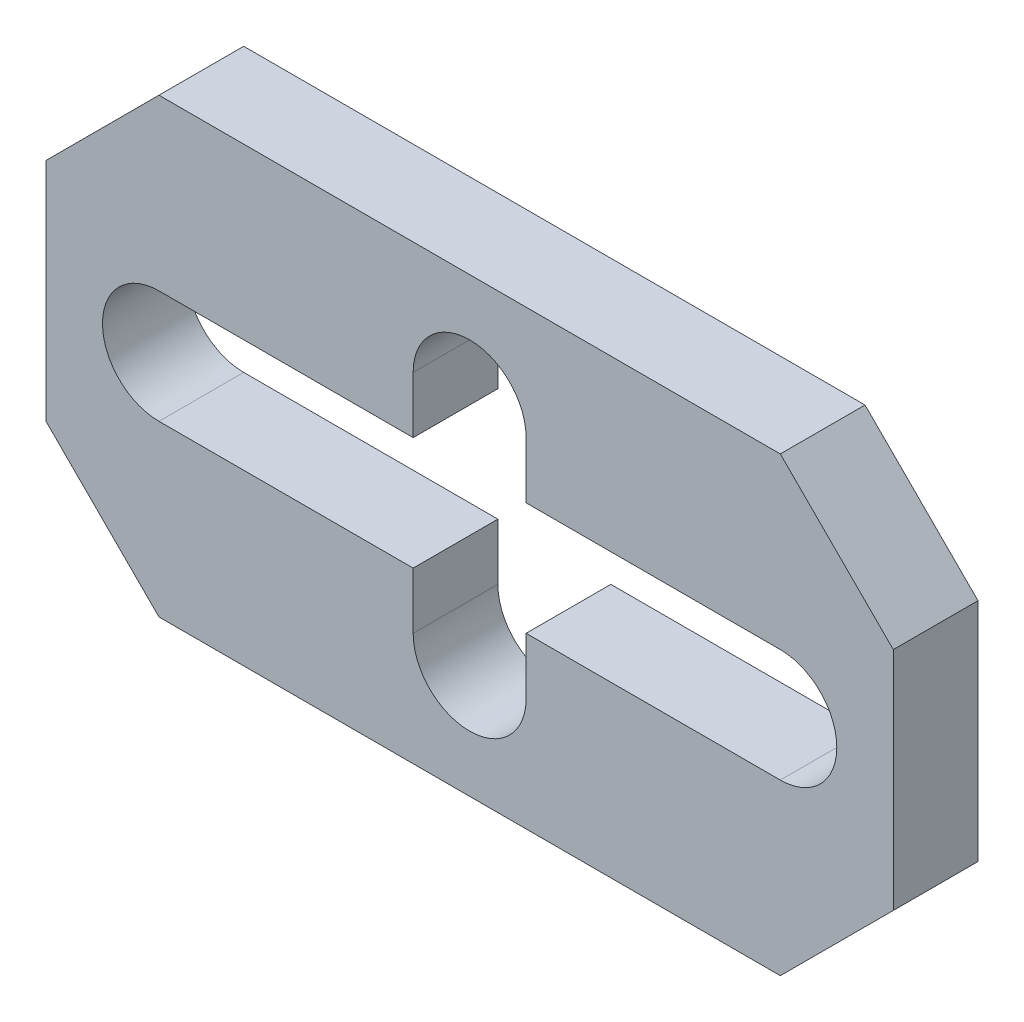
ISO-10303-21;
HEADER;
FILE_DESCRIPTION(('STEP AP214'),'2;1');
FILE_NAME('part.step','',(''),(''),'','','');
FILE_SCHEMA(('AUTOMOTIVE_DESIGN { 1 0 10303 214 1 1 1 1 }'));
ENDSEC;
DATA;
#1=APPLICATION_CONTEXT('core data for automotive mechanical design processes');
#2=APPLICATION_PROTOCOL_DEFINITION('international standard','automotive_design',2000,#1);
#3=PRODUCT_CONTEXT('',#1,'mechanical');
#4=PRODUCT('Part','Part','',(#3));
#5=PRODUCT_RELATED_PRODUCT_CATEGORY('part','',(#4));
#6=PRODUCT_DEFINITION_FORMATION('','',#4);
#7=PRODUCT_DEFINITION_CONTEXT('part definition',#1,'design');
#8=PRODUCT_DEFINITION('design','',#6,#7);
#9=PRODUCT_DEFINITION_SHAPE('','',#8);
#10=(LENGTH_UNIT() NAMED_UNIT(*) SI_UNIT(.MILLI.,.METRE.));
#11=(NAMED_UNIT(*) PLANE_ANGLE_UNIT() SI_UNIT($,.RADIAN.));
#12=(NAMED_UNIT(*) SI_UNIT($,.STERADIAN.) SOLID_ANGLE_UNIT());
#13=UNCERTAINTY_MEASURE_WITH_UNIT(LENGTH_MEASURE(1.E-05),#10,'distance_accuracy_value','');
#14=(GEOMETRIC_REPRESENTATION_CONTEXT(3) GLOBAL_UNCERTAINTY_ASSIGNED_CONTEXT((#13)) GLOBAL_UNIT_ASSIGNED_CONTEXT((#10,
#11,#12)) REPRESENTATION_CONTEXT('',''));
#15=CARTESIAN_POINT('',(0.,0.,0.));
#16=DIRECTION('',(0.,0.,1.));
#17=DIRECTION('',(1.,0.,0.));
#18=AXIS2_PLACEMENT_3D('',#15,#16,#17);
#19=CARTESIAN_POINT('',(0.,0.,15.));
#20=DIRECTION('',(0.,0.,1.));
#21=DIRECTION('',(1.,0.,0.));
#22=AXIS2_PLACEMENT_3D('',#19,#20,#21);
#23=PLANE('',#22);
#24=DIRECTION('',(-1.,0.,0.));
#25=VECTOR('',#24,1.);
#26=CARTESIAN_POINT('',(-55.,40.,15.));
#27=LINE('',#26,#25);
#28=CARTESIAN_POINT('',(55.,40.,15.));
#29=VERTEX_POINT('',#28);
#30=CARTESIAN_POINT('',(-55.,40.,15.));
#31=VERTEX_POINT('',#30);
#32=EDGE_CURVE('E263',#29,#31,#27,.T.);
#33=ORIENTED_EDGE('',*,*,#32,.T.);
#34=DIRECTION('',(-0.707106781186548,-0.707106781186547,0.));
#35=VECTOR('',#34,1.);
#36=CARTESIAN_POINT('',(-75.,20.,15.));
#37=LINE('',#36,#35);
#38=CARTESIAN_POINT('',(-75.,20.,15.));
#39=VERTEX_POINT('',#38);
#40=EDGE_CURVE('E266',#31,#39,#37,.T.);
#41=ORIENTED_EDGE('',*,*,#40,.T.);
#42=DIRECTION('',(0.,-1.,0.));
#43=VECTOR('',#42,1.);
#44=CARTESIAN_POINT('',(-75.,-20.,15.));
#45=LINE('',#44,#43);
#46=CARTESIAN_POINT('',(-75.,-20.,15.));
#47=VERTEX_POINT('',#46);
#48=EDGE_CURVE('E269',#39,#47,#45,.T.);
#49=ORIENTED_EDGE('',*,*,#48,.T.);
#50=DIRECTION('',(0.707106781186548,-0.707106781186547,0.));
#51=VECTOR('',#50,1.);
#52=CARTESIAN_POINT('',(-55.,-40.,15.));
#53=LINE('',#52,#51);
#54=CARTESIAN_POINT('',(-55.,-40.,15.));
#55=VERTEX_POINT('',#54);
#56=EDGE_CURVE('E271',#47,#55,#53,.T.);
#57=ORIENTED_EDGE('',*,*,#56,.T.);
#58=DIRECTION('',(1.,0.,0.));
#59=VECTOR('',#58,1.);
#60=CARTESIAN_POINT('',(-55.,-40.,15.));
#61=LINE('',#60,#59);
#62=CARTESIAN_POINT('',(55.,-40.,15.));
#63=VERTEX_POINT('',#62);
#64=EDGE_CURVE('E273',#55,#63,#61,.T.);
#65=ORIENTED_EDGE('',*,*,#64,.T.);
#66=DIRECTION('',(0.707106781186548,0.707106781186547,0.));
#67=VECTOR('',#66,1.);
#68=CARTESIAN_POINT('',(55.,-40.,15.));
#69=LINE('',#68,#67);
#70=CARTESIAN_POINT('',(75.,-20.,15.));
#71=VERTEX_POINT('',#70);
#72=EDGE_CURVE('E275',#63,#71,#69,.T.);
#73=ORIENTED_EDGE('',*,*,#72,.T.);
#74=DIRECTION('',(0.,1.,0.));
#75=VECTOR('',#74,1.);
#76=CARTESIAN_POINT('',(75.,-20.,15.));
#77=LINE('',#76,#75);
#78=CARTESIAN_POINT('',(75.,20.,15.));
#79=VERTEX_POINT('',#78);
#80=EDGE_CURVE('E277',#71,#79,#77,.T.);
#81=ORIENTED_EDGE('',*,*,#80,.T.);
#82=DIRECTION('',(-0.707106781186548,0.707106781186547,0.));
#83=VECTOR('',#82,1.);
#84=CARTESIAN_POINT('',(55.,40.,15.));
#85=LINE('',#84,#83);
#86=EDGE_CURVE('E279',#79,#29,#85,.T.);
#87=ORIENTED_EDGE('',*,*,#86,.T.);
#88=EDGE_LOOP('',(#33,#41,#49,#57,#65,#73,#81,#87));
#89=FACE_BOUND('',#88,.T.);
#90=DIRECTION('',(0.,-1.,0.));
#91=VECTOR('',#90,1.);
#92=CARTESIAN_POINT('',(-10.,10.,15.));
#93=LINE('',#92,#91);
#94=CARTESIAN_POINT('',(-10.,20.,15.));
#95=VERTEX_POINT('',#94);
#96=CARTESIAN_POINT('',(-10.,10.,15.));
#97=VERTEX_POINT('',#96);
#98=EDGE_CURVE('E178',#95,#97,#93,.T.);
#99=ORIENTED_EDGE('',*,*,#98,.F.);
#100=CARTESIAN_POINT('',(0.,20.,15.));
#101=DIRECTION('',(0.,0.,1.));
#102=DIRECTION('',(1.,0.,0.));
#103=AXIS2_PLACEMENT_3D('',#100,#101,#102);
#104=CIRCLE('',#103,10.);
#105=CARTESIAN_POINT('',(10.,20.,15.));
#106=VERTEX_POINT('',#105);
#107=EDGE_CURVE('E170',#106,#95,#104,.T.);
#108=ORIENTED_EDGE('',*,*,#107,.F.);
#109=DIRECTION('',(0.,1.,0.));
#110=VECTOR('',#109,1.);
#111=CARTESIAN_POINT('',(10.,10.,15.));
#112=LINE('',#111,#110);
#113=CARTESIAN_POINT('',(10.,10.,15.));
#114=VERTEX_POINT('',#113);
#115=EDGE_CURVE('E211',#114,#106,#112,.T.);
#116=ORIENTED_EDGE('',*,*,#115,.F.);
#117=DIRECTION('',(-1.,0.,0.));
#118=VECTOR('',#117,1.);
#119=CARTESIAN_POINT('',(10.,10.,15.));
#120=LINE('',#119,#118);
#121=CARTESIAN_POINT('',(55.,10.,15.));
#122=VERTEX_POINT('',#121);
#123=EDGE_CURVE('E209',#122,#114,#120,.T.);
#124=ORIENTED_EDGE('',*,*,#123,.F.);
#125=CARTESIAN_POINT('',(55.,0.,15.));
#126=DIRECTION('',(0.,0.,1.));
#127=DIRECTION('',(1.,0.,0.));
#128=AXIS2_PLACEMENT_3D('',#125,#126,#127);
#129=CIRCLE('',#128,10.);
#130=CARTESIAN_POINT('',(55.,-10.,15.));
#131=VERTEX_POINT('',#130);
#132=EDGE_CURVE('E207',#131,#122,#129,.T.);
#133=ORIENTED_EDGE('',*,*,#132,.F.);
#134=DIRECTION('',(1.,0.,0.));
#135=VECTOR('',#134,1.);
#136=CARTESIAN_POINT('',(10.,-10.,15.));
#137=LINE('',#136,#135);
#138=CARTESIAN_POINT('',(10.,-10.,15.));
#139=VERTEX_POINT('',#138);
#140=EDGE_CURVE('E205',#139,#131,#137,.T.);
#141=ORIENTED_EDGE('',*,*,#140,.F.);
#142=DIRECTION('',(0.,1.,0.));
#143=VECTOR('',#142,1.);
#144=CARTESIAN_POINT('',(10.,-20.,15.));
#145=LINE('',#144,#143);
#146=CARTESIAN_POINT('',(10.,-20.,15.));
#147=VERTEX_POINT('',#146);
#148=EDGE_CURVE('E203',#147,#139,#145,.T.);
#149=ORIENTED_EDGE('',*,*,#148,.F.);
#150=CARTESIAN_POINT('',(0.,-20.,15.));
#151=DIRECTION('',(0.,0.,1.));
#152=DIRECTION('',(1.,0.,0.));
#153=AXIS2_PLACEMENT_3D('',#150,#151,#152);
#154=CIRCLE('',#153,10.);
#155=CARTESIAN_POINT('',(-10.,-20.,15.));
#156=VERTEX_POINT('',#155);
#157=EDGE_CURVE('E201',#156,#147,#154,.T.);
#158=ORIENTED_EDGE('',*,*,#157,.F.);
#159=DIRECTION('',(0.,-1.,0.));
#160=VECTOR('',#159,1.);
#161=CARTESIAN_POINT('',(-10.,-20.,15.));
#162=LINE('',#161,#160);
#163=CARTESIAN_POINT('',(-10.,-10.,15.));
#164=VERTEX_POINT('',#163);
#165=EDGE_CURVE('E199',#164,#156,#162,.T.);
#166=ORIENTED_EDGE('',*,*,#165,.F.);
#167=DIRECTION('',(1.,0.,0.));
#168=VECTOR('',#167,1.);
#169=CARTESIAN_POINT('',(-55.,-10.,15.));
#170=LINE('',#169,#168);
#171=CARTESIAN_POINT('',(-55.,-10.,15.));
#172=VERTEX_POINT('',#171);
#173=EDGE_CURVE('E197',#172,#164,#170,.T.);
#174=ORIENTED_EDGE('',*,*,#173,.F.);
#175=CARTESIAN_POINT('',(-55.,0.,15.));
#176=DIRECTION('',(0.,0.,1.));
#177=DIRECTION('',(1.,0.,0.));
#178=AXIS2_PLACEMENT_3D('',#175,#176,#177);
#179=CIRCLE('',#178,10.);
#180=CARTESIAN_POINT('',(-55.,10.,15.));
#181=VERTEX_POINT('',#180);
#182=EDGE_CURVE('E193',#181,#172,#179,.T.);
#183=ORIENTED_EDGE('',*,*,#182,.F.);
#184=DIRECTION('',(-1.,0.,0.));
#185=VECTOR('',#184,1.);
#186=CARTESIAN_POINT('',(-55.,10.,15.));
#187=LINE('',#186,#185);
#188=EDGE_CURVE('E191',#97,#181,#187,.T.);
#189=ORIENTED_EDGE('',*,*,#188,.F.);
#190=EDGE_LOOP('',(#99,#108,#116,#124,#133,#141,#149,#158,#166,#174,#183,#189));
#191=FACE_BOUND('',#190,.T.);
#192=ADVANCED_FACE('F33',(#89,#191),#23,.T.);
#193=CARTESIAN_POINT('',(0.,0.,0.));
#194=DIRECTION('',(0.,0.,1.));
#195=DIRECTION('',(1.,0.,0.));
#196=AXIS2_PLACEMENT_3D('',#193,#194,#195);
#197=PLANE('',#196);
#198=DIRECTION('',(-1.,0.,0.));
#199=VECTOR('',#198,1.);
#200=CARTESIAN_POINT('',(-55.,40.,0.));
#201=LINE('',#200,#199);
#202=CARTESIAN_POINT('',(55.,40.,0.));
#203=VERTEX_POINT('',#202);
#204=CARTESIAN_POINT('',(-55.,40.,0.));
#205=VERTEX_POINT('',#204);
#206=EDGE_CURVE('E186',#203,#205,#201,.T.);
#207=ORIENTED_EDGE('',*,*,#206,.F.);
#208=DIRECTION('',(-0.707106781186548,0.707106781186547,0.));
#209=VECTOR('',#208,1.);
#210=CARTESIAN_POINT('',(55.,40.,0.));
#211=LINE('',#210,#209);
#212=CARTESIAN_POINT('',(75.,20.,0.));
#213=VERTEX_POINT('',#212);
#214=EDGE_CURVE('E267',#213,#203,#211,.T.);
#215=ORIENTED_EDGE('',*,*,#214,.F.);
#216=DIRECTION('',(0.,1.,0.));
#217=VECTOR('',#216,1.);
#218=CARTESIAN_POINT('',(75.,-20.,0.));
#219=LINE('',#218,#217);
#220=CARTESIAN_POINT('',(75.,-20.,0.));
#221=VERTEX_POINT('',#220);
#222=EDGE_CURVE('E294',#221,#213,#219,.T.);
#223=ORIENTED_EDGE('',*,*,#222,.F.);
#224=DIRECTION('',(0.707106781186548,0.707106781186547,0.));
#225=VECTOR('',#224,1.);
#226=CARTESIAN_POINT('',(55.,-40.,0.));
#227=LINE('',#226,#225);
#228=CARTESIAN_POINT('',(55.,-40.,0.));
#229=VERTEX_POINT('',#228);
#230=EDGE_CURVE('E292',#229,#221,#227,.T.);
#231=ORIENTED_EDGE('',*,*,#230,.F.);
#232=DIRECTION('',(1.,0.,0.));
#233=VECTOR('',#232,1.);
#234=CARTESIAN_POINT('',(-55.,-40.,0.));
#235=LINE('',#234,#233);
#236=CARTESIAN_POINT('',(-55.,-40.,0.));
#237=VERTEX_POINT('',#236);
#238=EDGE_CURVE('E290',#237,#229,#235,.T.);
#239=ORIENTED_EDGE('',*,*,#238,.F.);
#240=DIRECTION('',(0.707106781186548,-0.707106781186547,0.));
#241=VECTOR('',#240,1.);
#242=CARTESIAN_POINT('',(-55.,-40.,0.));
#243=LINE('',#242,#241);
#244=CARTESIAN_POINT('',(-75.,-20.,0.));
#245=VERTEX_POINT('',#244);
#246=EDGE_CURVE('E288',#245,#237,#243,.T.);
#247=ORIENTED_EDGE('',*,*,#246,.F.);
#248=DIRECTION('',(0.,-1.,0.));
#249=VECTOR('',#248,1.);
#250=CARTESIAN_POINT('',(-75.,-20.,0.));
#251=LINE('',#250,#249);
#252=CARTESIAN_POINT('',(-75.,20.,0.));
#253=VERTEX_POINT('',#252);
#254=EDGE_CURVE('E286',#253,#245,#251,.T.);
#255=ORIENTED_EDGE('',*,*,#254,.F.);
#256=DIRECTION('',(-0.707106781186548,-0.707106781186547,0.));
#257=VECTOR('',#256,1.);
#258=CARTESIAN_POINT('',(-75.,20.,0.));
#259=LINE('',#258,#257);
#260=EDGE_CURVE('E284',#205,#253,#259,.T.);
#261=ORIENTED_EDGE('',*,*,#260,.F.);
#262=EDGE_LOOP('',(#207,#215,#223,#231,#239,#247,#255,#261));
#263=FACE_BOUND('',#262,.T.);
#264=CARTESIAN_POINT('',(0.,20.,0.));
#265=DIRECTION('',(0.,0.,1.));
#266=DIRECTION('',(1.,0.,0.));
#267=AXIS2_PLACEMENT_3D('',#264,#265,#266);
#268=CIRCLE('',#267,10.);
#269=CARTESIAN_POINT('',(10.,20.,0.));
#270=VERTEX_POINT('',#269);
#271=CARTESIAN_POINT('',(-10.,20.,0.));
#272=VERTEX_POINT('',#271);
#273=EDGE_CURVE('E56',#270,#272,#268,.T.);
#274=ORIENTED_EDGE('',*,*,#273,.T.);
#275=DIRECTION('',(0.,-1.,0.));
#276=VECTOR('',#275,1.);
#277=CARTESIAN_POINT('',(-10.,10.,0.));
#278=LINE('',#277,#276);
#279=CARTESIAN_POINT('',(-10.,10.,0.));
#280=VERTEX_POINT('',#279);
#281=EDGE_CURVE('E185',#272,#280,#278,.T.);
#282=ORIENTED_EDGE('',*,*,#281,.T.);
#283=DIRECTION('',(-1.,0.,0.));
#284=VECTOR('',#283,1.);
#285=CARTESIAN_POINT('',(-55.,10.,0.));
#286=LINE('',#285,#284);
#287=CARTESIAN_POINT('',(-55.,10.,0.));
#288=VERTEX_POINT('',#287);
#289=EDGE_CURVE('E215',#280,#288,#286,.T.);
#290=ORIENTED_EDGE('',*,*,#289,.T.);
#291=CARTESIAN_POINT('',(-55.,0.,0.));
#292=DIRECTION('',(0.,0.,1.));
#293=DIRECTION('',(1.,0.,0.));
#294=AXIS2_PLACEMENT_3D('',#291,#292,#293);
#295=CIRCLE('',#294,10.);
#296=CARTESIAN_POINT('',(-55.,-10.,0.));
#297=VERTEX_POINT('',#296);
#298=EDGE_CURVE('E218',#288,#297,#295,.T.);
#299=ORIENTED_EDGE('',*,*,#298,.T.);
#300=DIRECTION('',(1.,0.,0.));
#301=VECTOR('',#300,1.);
#302=CARTESIAN_POINT('',(-55.,-10.,0.));
#303=LINE('',#302,#301);
#304=CARTESIAN_POINT('',(-10.,-10.,0.));
#305=VERTEX_POINT('',#304);
#306=EDGE_CURVE('E221',#297,#305,#303,.T.);
#307=ORIENTED_EDGE('',*,*,#306,.T.);
#308=DIRECTION('',(0.,-1.,0.));
#309=VECTOR('',#308,1.);
#310=CARTESIAN_POINT('',(-10.,-20.,0.));
#311=LINE('',#310,#309);
#312=CARTESIAN_POINT('',(-10.,-20.,0.));
#313=VERTEX_POINT('',#312);
#314=EDGE_CURVE('E224',#305,#313,#311,.T.);
#315=ORIENTED_EDGE('',*,*,#314,.T.);
#316=CARTESIAN_POINT('',(0.,-20.,0.));
#317=DIRECTION('',(0.,0.,1.));
#318=DIRECTION('',(1.,0.,0.));
#319=AXIS2_PLACEMENT_3D('',#316,#317,#318);
#320=CIRCLE('',#319,10.);
#321=CARTESIAN_POINT('',(10.,-20.,0.));
#322=VERTEX_POINT('',#321);
#323=EDGE_CURVE('E227',#313,#322,#320,.T.);
#324=ORIENTED_EDGE('',*,*,#323,.T.);
#325=DIRECTION('',(0.,1.,0.));
#326=VECTOR('',#325,1.);
#327=CARTESIAN_POINT('',(10.,-20.,0.));
#328=LINE('',#327,#326);
#329=CARTESIAN_POINT('',(10.,-10.,0.));
#330=VERTEX_POINT('',#329);
#331=EDGE_CURVE('E230',#322,#330,#328,.T.);
#332=ORIENTED_EDGE('',*,*,#331,.T.);
#333=DIRECTION('',(1.,0.,0.));
#334=VECTOR('',#333,1.);
#335=CARTESIAN_POINT('',(10.,-10.,0.));
#336=LINE('',#335,#334);
#337=CARTESIAN_POINT('',(55.,-10.,0.));
#338=VERTEX_POINT('',#337);
#339=EDGE_CURVE('E233',#330,#338,#336,.T.);
#340=ORIENTED_EDGE('',*,*,#339,.T.);
#341=CARTESIAN_POINT('',(55.,0.,0.));
#342=DIRECTION('',(0.,0.,1.));
#343=DIRECTION('',(1.,0.,0.));
#344=AXIS2_PLACEMENT_3D('',#341,#342,#343);
#345=CIRCLE('',#344,10.);
#346=CARTESIAN_POINT('',(55.,10.,0.));
#347=VERTEX_POINT('',#346);
#348=EDGE_CURVE('E236',#338,#347,#345,.T.);
#349=ORIENTED_EDGE('',*,*,#348,.T.);
#350=DIRECTION('',(-1.,0.,0.));
#351=VECTOR('',#350,1.);
#352=CARTESIAN_POINT('',(10.,10.,0.));
#353=LINE('',#352,#351);
#354=CARTESIAN_POINT('',(10.,10.,0.));
#355=VERTEX_POINT('',#354);
#356=EDGE_CURVE('E239',#347,#355,#353,.T.);
#357=ORIENTED_EDGE('',*,*,#356,.T.);
#358=DIRECTION('',(0.,1.,0.));
#359=VECTOR('',#358,1.);
#360=CARTESIAN_POINT('',(10.,10.,0.));
#361=LINE('',#360,#359);
#362=EDGE_CURVE('E179',#355,#270,#361,.T.);
#363=ORIENTED_EDGE('',*,*,#362,.T.);
#364=EDGE_LOOP('',(#274,#282,#290,#299,#307,#315,#324,#332,#340,#349,#357,#363));
#365=FACE_BOUND('',#364,.T.);
#366=ADVANCED_FACE('F324',(#263,#365),#197,.F.);
#367=CARTESIAN_POINT('',(-55.,40.,15.));
#368=DIRECTION('',(0.,-1.,0.));
#369=DIRECTION('',(0.,0.,-1.));
#370=AXIS2_PLACEMENT_3D('',#367,#368,#369);
#371=PLANE('',#370);
#372=ORIENTED_EDGE('',*,*,#206,.T.);
#373=DIRECTION('',(0.,0.,-1.));
#374=VECTOR('',#373,1.);
#375=CARTESIAN_POINT('',(-55.,40.,15.));
#376=LINE('',#375,#374);
#377=EDGE_CURVE('E11',#31,#205,#376,.T.);
#378=ORIENTED_EDGE('',*,*,#377,.F.);
#379=ORIENTED_EDGE('',*,*,#32,.F.);
#380=DIRECTION('',(0.,0.,-1.));
#381=VECTOR('',#380,1.);
#382=CARTESIAN_POINT('',(55.,40.,15.));
#383=LINE('',#382,#381);
#384=EDGE_CURVE('E281',#29,#203,#383,.T.);
#385=ORIENTED_EDGE('',*,*,#384,.T.);
#386=EDGE_LOOP('',(#372,#378,#379,#385));
#387=FACE_BOUND('',#386,.T.);
#388=ADVANCED_FACE('F35',(#387),#371,.F.);
#389=CARTESIAN_POINT('',(-75.,20.,15.));
#390=DIRECTION('',(0.707106781186547,-0.707106781186548,0.));
#391=DIRECTION('',(0.707106781186548,0.707106781186547,0.));
#392=AXIS2_PLACEMENT_3D('',#389,#390,#391);
#393=PLANE('',#392);
#394=ORIENTED_EDGE('',*,*,#260,.T.);
#395=DIRECTION('',(0.,0.,-1.));
#396=VECTOR('',#395,1.);
#397=CARTESIAN_POINT('',(-75.,20.,15.));
#398=LINE('',#397,#396);
#399=EDGE_CURVE('E41',#39,#253,#398,.T.);
#400=ORIENTED_EDGE('',*,*,#399,.F.);
#401=ORIENTED_EDGE('',*,*,#40,.F.);
#402=ORIENTED_EDGE('',*,*,#377,.T.);
#403=EDGE_LOOP('',(#394,#400,#401,#402));
#404=FACE_BOUND('',#403,.T.);
#405=ADVANCED_FACE('F341',(#404),#393,.F.);
#406=CARTESIAN_POINT('',(-75.,-20.,15.));
#407=DIRECTION('',(1.,0.,0.));
#408=DIRECTION('',(0.,0.,-1.));
#409=AXIS2_PLACEMENT_3D('',#406,#407,#408);
#410=PLANE('',#409);
#411=ORIENTED_EDGE('',*,*,#254,.T.);
#412=DIRECTION('',(0.,0.,-1.));
#413=VECTOR('',#412,1.);
#414=CARTESIAN_POINT('',(-75.,-20.,15.));
#415=LINE('',#414,#413);
#416=EDGE_CURVE('E311',#47,#245,#415,.T.);
#417=ORIENTED_EDGE('',*,*,#416,.F.);
#418=ORIENTED_EDGE('',*,*,#48,.F.);
#419=ORIENTED_EDGE('',*,*,#399,.T.);
#420=EDGE_LOOP('',(#411,#417,#418,#419));
#421=FACE_BOUND('',#420,.T.);
#422=ADVANCED_FACE('F318',(#421),#410,.F.);
#423=CARTESIAN_POINT('',(-55.,-40.,15.));
#424=DIRECTION('',(0.707106781186547,0.707106781186548,0.));
#425=DIRECTION('',(-0.707106781186548,0.707106781186547,0.));
#426=AXIS2_PLACEMENT_3D('',#423,#424,#425);
#427=PLANE('',#426);
#428=ORIENTED_EDGE('',*,*,#246,.T.);
#429=DIRECTION('',(0.,0.,-1.));
#430=VECTOR('',#429,1.);
#431=CARTESIAN_POINT('',(-55.,-40.,15.));
#432=LINE('',#431,#430);
#433=EDGE_CURVE('E308',#55,#237,#432,.T.);
#434=ORIENTED_EDGE('',*,*,#433,.F.);
#435=ORIENTED_EDGE('',*,*,#56,.F.);
#436=ORIENTED_EDGE('',*,*,#416,.T.);
#437=EDGE_LOOP('',(#428,#434,#435,#436));
#438=FACE_BOUND('',#437,.T.);
#439=ADVANCED_FACE('F330',(#438),#427,.F.);
#440=CARTESIAN_POINT('',(-55.,-40.,15.));
#441=DIRECTION('',(0.,1.,0.));
#442=DIRECTION('',(0.,0.,1.));
#443=AXIS2_PLACEMENT_3D('',#440,#441,#442);
#444=PLANE('',#443);
#445=ORIENTED_EDGE('',*,*,#238,.T.);
#446=DIRECTION('',(0.,0.,-1.));
#447=VECTOR('',#446,1.);
#448=CARTESIAN_POINT('',(55.,-40.,15.));
#449=LINE('',#448,#447);
#450=EDGE_CURVE('E305',#63,#229,#449,.T.);
#451=ORIENTED_EDGE('',*,*,#450,.F.);
#452=ORIENTED_EDGE('',*,*,#64,.F.);
#453=ORIENTED_EDGE('',*,*,#433,.T.);
#454=EDGE_LOOP('',(#445,#451,#452,#453));
#455=FACE_BOUND('',#454,.T.);
#456=ADVANCED_FACE('F334',(#455),#444,.F.);
#457=CARTESIAN_POINT('',(55.,-40.,15.));
#458=DIRECTION('',(-0.707106781186547,0.707106781186548,0.));
#459=DIRECTION('',(-0.707106781186548,-0.707106781186547,0.));
#460=AXIS2_PLACEMENT_3D('',#457,#458,#459);
#461=PLANE('',#460);
#462=ORIENTED_EDGE('',*,*,#230,.T.);
#463=DIRECTION('',(0.,0.,-1.));
#464=VECTOR('',#463,1.);
#465=CARTESIAN_POINT('',(75.,-20.,15.));
#466=LINE('',#465,#464);
#467=EDGE_CURVE('E302',#71,#221,#466,.T.);
#468=ORIENTED_EDGE('',*,*,#467,.F.);
#469=ORIENTED_EDGE('',*,*,#72,.F.);
#470=ORIENTED_EDGE('',*,*,#450,.T.);
#471=EDGE_LOOP('',(#462,#468,#469,#470));
#472=FACE_BOUND('',#471,.T.);
#473=ADVANCED_FACE('F354',(#472),#461,.F.);
#474=CARTESIAN_POINT('',(75.,-20.,15.));
#475=DIRECTION('',(-1.,0.,0.));
#476=DIRECTION('',(0.,-1.,0.));
#477=AXIS2_PLACEMENT_3D('',#474,#475,#476);
#478=PLANE('',#477);
#479=ORIENTED_EDGE('',*,*,#222,.T.);
#480=DIRECTION('',(0.,0.,-1.));
#481=VECTOR('',#480,1.);
#482=CARTESIAN_POINT('',(75.,20.,15.));
#483=LINE('',#482,#481);
#484=EDGE_CURVE('E299',#79,#213,#483,.T.);
#485=ORIENTED_EDGE('',*,*,#484,.F.);
#486=ORIENTED_EDGE('',*,*,#80,.F.);
#487=ORIENTED_EDGE('',*,*,#467,.T.);
#488=EDGE_LOOP('',(#479,#485,#486,#487));
#489=FACE_BOUND('',#488,.T.);
#490=ADVANCED_FACE('F352',(#489),#478,.F.);
#491=CARTESIAN_POINT('',(55.,40.,15.));
#492=DIRECTION('',(-0.707106781186547,-0.707106781186548,0.));
#493=DIRECTION('',(0.707106781186548,-0.707106781186547,0.));
#494=AXIS2_PLACEMENT_3D('',#491,#492,#493);
#495=PLANE('',#494);
#496=ORIENTED_EDGE('',*,*,#214,.T.);
#497=ORIENTED_EDGE('',*,*,#384,.F.);
#498=ORIENTED_EDGE('',*,*,#86,.F.);
#499=ORIENTED_EDGE('',*,*,#484,.T.);
#500=EDGE_LOOP('',(#496,#497,#498,#499));
#501=FACE_BOUND('',#500,.T.);
#502=ADVANCED_FACE('F347',(#501),#495,.F.);
#503=CARTESIAN_POINT('',(0.,20.,15.));
#504=DIRECTION('',(0.,0.,-1.));
#505=DIRECTION('',(-1.,0.,0.));
#506=AXIS2_PLACEMENT_3D('',#503,#504,#505);
#507=CYLINDRICAL_SURFACE('',#506,10.);
#508=ORIENTED_EDGE('',*,*,#273,.F.);
#509=DIRECTION('',(0.,0.,-1.));
#510=VECTOR('',#509,1.);
#511=CARTESIAN_POINT('',(10.,20.,15.));
#512=LINE('',#511,#510);
#513=EDGE_CURVE('E174',#106,#270,#512,.T.);
#514=ORIENTED_EDGE('',*,*,#513,.F.);
#515=ORIENTED_EDGE('',*,*,#107,.T.);
#516=DIRECTION('',(0.,0.,-1.));
#517=VECTOR('',#516,1.);
#518=CARTESIAN_POINT('',(-10.,20.,15.));
#519=LINE('',#518,#517);
#520=EDGE_CURVE('E173',#95,#272,#519,.T.);
#521=ORIENTED_EDGE('',*,*,#520,.T.);
#522=EDGE_LOOP('',(#508,#514,#515,#521));
#523=FACE_BOUND('',#522,.T.);
#524=ADVANCED_FACE('F172',(#523),#507,.F.);
#525=CARTESIAN_POINT('',(-10.,10.,15.));
#526=DIRECTION('',(1.,0.,0.));
#527=DIRECTION('',(0.,0.,-1.));
#528=AXIS2_PLACEMENT_3D('',#525,#526,#527);
#529=PLANE('',#528);
#530=ORIENTED_EDGE('',*,*,#281,.F.);
#531=ORIENTED_EDGE('',*,*,#520,.F.);
#532=ORIENTED_EDGE('',*,*,#98,.T.);
#533=DIRECTION('',(0.,0.,-1.));
#534=VECTOR('',#533,1.);
#535=CARTESIAN_POINT('',(-10.,10.,15.));
#536=LINE('',#535,#534);
#537=EDGE_CURVE('E187',#97,#280,#536,.T.);
#538=ORIENTED_EDGE('',*,*,#537,.T.);
#539=EDGE_LOOP('',(#530,#531,#532,#538));
#540=FACE_BOUND('',#539,.T.);
#541=ADVANCED_FACE('F182',(#540),#529,.T.);
#542=CARTESIAN_POINT('',(-55.,10.,15.));
#543=DIRECTION('',(0.,-1.,0.));
#544=DIRECTION('',(1.,0.,0.));
#545=AXIS2_PLACEMENT_3D('',#542,#543,#544);
#546=PLANE('',#545);
#547=ORIENTED_EDGE('',*,*,#289,.F.);
#548=ORIENTED_EDGE('',*,*,#537,.F.);
#549=ORIENTED_EDGE('',*,*,#188,.T.);
#550=DIRECTION('',(0.,0.,-1.));
#551=VECTOR('',#550,1.);
#552=CARTESIAN_POINT('',(-55.,10.,15.));
#553=LINE('',#552,#551);
#554=EDGE_CURVE('E260',#181,#288,#553,.T.);
#555=ORIENTED_EDGE('',*,*,#554,.T.);
#556=EDGE_LOOP('',(#547,#548,#549,#555));
#557=FACE_BOUND('',#556,.T.);
#558=ADVANCED_FACE('F379',(#557),#546,.T.);
#559=CARTESIAN_POINT('',(-55.,0.,15.));
#560=DIRECTION('',(0.,0.,-1.));
#561=DIRECTION('',(-1.,0.,0.));
#562=AXIS2_PLACEMENT_3D('',#559,#560,#561);
#563=CYLINDRICAL_SURFACE('',#562,10.);
#564=ORIENTED_EDGE('',*,*,#298,.F.);
#565=ORIENTED_EDGE('',*,*,#554,.F.);
#566=ORIENTED_EDGE('',*,*,#182,.T.);
#567=DIRECTION('',(0.,0.,-1.));
#568=VECTOR('',#567,1.);
#569=CARTESIAN_POINT('',(-55.,-10.,15.));
#570=LINE('',#569,#568);
#571=EDGE_CURVE('E258',#172,#297,#570,.T.);
#572=ORIENTED_EDGE('',*,*,#571,.T.);
#573=EDGE_LOOP('',(#564,#565,#566,#572));
#574=FACE_BOUND('',#573,.T.);
#575=ADVANCED_FACE('F383',(#574),#563,.F.);
#576=CARTESIAN_POINT('',(-55.,-10.,15.));
#577=DIRECTION('',(0.,1.,0.));
#578=DIRECTION('',(0.,0.,1.));
#579=AXIS2_PLACEMENT_3D('',#576,#577,#578);
#580=PLANE('',#579);
#581=ORIENTED_EDGE('',*,*,#306,.F.);
#582=ORIENTED_EDGE('',*,*,#571,.F.);
#583=ORIENTED_EDGE('',*,*,#173,.T.);
#584=DIRECTION('',(0.,0.,-1.));
#585=VECTOR('',#584,1.);
#586=CARTESIAN_POINT('',(-10.,-10.,15.));
#587=LINE('',#586,#585);
#588=EDGE_CURVE('E256',#164,#305,#587,.T.);
#589=ORIENTED_EDGE('',*,*,#588,.T.);
#590=EDGE_LOOP('',(#581,#582,#583,#589));
#591=FACE_BOUND('',#590,.T.);
#592=ADVANCED_FACE('F389',(#591),#580,.T.);
#593=CARTESIAN_POINT('',(-10.,-20.,15.));
#594=DIRECTION('',(1.,0.,0.));
#595=DIRECTION('',(0.,0.,-1.));
#596=AXIS2_PLACEMENT_3D('',#593,#594,#595);
#597=PLANE('',#596);
#598=ORIENTED_EDGE('',*,*,#314,.F.);
#599=ORIENTED_EDGE('',*,*,#588,.F.);
#600=ORIENTED_EDGE('',*,*,#165,.T.);
#601=DIRECTION('',(0.,0.,-1.));
#602=VECTOR('',#601,1.);
#603=CARTESIAN_POINT('',(-10.,-20.,15.));
#604=LINE('',#603,#602);
#605=EDGE_CURVE('E254',#156,#313,#604,.T.);
#606=ORIENTED_EDGE('',*,*,#605,.T.);
#607=EDGE_LOOP('',(#598,#599,#600,#606));
#608=FACE_BOUND('',#607,.T.);
#609=ADVANCED_FACE('F393',(#608),#597,.T.);
#610=CARTESIAN_POINT('',(0.,-20.,15.));
#611=DIRECTION('',(0.,0.,-1.));
#612=DIRECTION('',(-1.,0.,0.));
#613=AXIS2_PLACEMENT_3D('',#610,#611,#612);
#614=CYLINDRICAL_SURFACE('',#613,10.);
#615=ORIENTED_EDGE('',*,*,#323,.F.);
#616=ORIENTED_EDGE('',*,*,#605,.F.);
#617=ORIENTED_EDGE('',*,*,#157,.T.);
#618=DIRECTION('',(0.,0.,-1.));
#619=VECTOR('',#618,1.);
#620=CARTESIAN_POINT('',(10.,-20.,15.));
#621=LINE('',#620,#619);
#622=EDGE_CURVE('E252',#147,#322,#621,.T.);
#623=ORIENTED_EDGE('',*,*,#622,.T.);
#624=EDGE_LOOP('',(#615,#616,#617,#623));
#625=FACE_BOUND('',#624,.T.);
#626=ADVANCED_FACE('F397',(#625),#614,.F.);
#627=CARTESIAN_POINT('',(10.,-20.,15.));
#628=DIRECTION('',(-1.,0.,0.));
#629=DIRECTION('',(0.,-1.,0.));
#630=AXIS2_PLACEMENT_3D('',#627,#628,#629);
#631=PLANE('',#630);
#632=ORIENTED_EDGE('',*,*,#331,.F.);
#633=ORIENTED_EDGE('',*,*,#622,.F.);
#634=ORIENTED_EDGE('',*,*,#148,.T.);
#635=DIRECTION('',(0.,0.,-1.));
#636=VECTOR('',#635,1.);
#637=CARTESIAN_POINT('',(10.,-10.,15.));
#638=LINE('',#637,#636);
#639=EDGE_CURVE('E250',#139,#330,#638,.T.);
#640=ORIENTED_EDGE('',*,*,#639,.T.);
#641=EDGE_LOOP('',(#632,#633,#634,#640));
#642=FACE_BOUND('',#641,.T.);
#643=ADVANCED_FACE('F401',(#642),#631,.T.);
#644=CARTESIAN_POINT('',(10.,-10.,15.));
#645=DIRECTION('',(0.,1.,0.));
#646=DIRECTION('',(0.,0.,1.));
#647=AXIS2_PLACEMENT_3D('',#644,#645,#646);
#648=PLANE('',#647);
#649=ORIENTED_EDGE('',*,*,#339,.F.);
#650=ORIENTED_EDGE('',*,*,#639,.F.);
#651=ORIENTED_EDGE('',*,*,#140,.T.);
#652=DIRECTION('',(0.,0.,-1.));
#653=VECTOR('',#652,1.);
#654=CARTESIAN_POINT('',(55.,-10.,15.));
#655=LINE('',#654,#653);
#656=EDGE_CURVE('E248',#131,#338,#655,.T.);
#657=ORIENTED_EDGE('',*,*,#656,.T.);
#658=EDGE_LOOP('',(#649,#650,#651,#657));
#659=FACE_BOUND('',#658,.T.);
#660=ADVANCED_FACE('F405',(#659),#648,.T.);
#661=CARTESIAN_POINT('',(55.,0.,15.));
#662=DIRECTION('',(0.,0.,-1.));
#663=DIRECTION('',(-1.,0.,0.));
#664=AXIS2_PLACEMENT_3D('',#661,#662,#663);
#665=CYLINDRICAL_SURFACE('',#664,10.);
#666=ORIENTED_EDGE('',*,*,#348,.F.);
#667=ORIENTED_EDGE('',*,*,#656,.F.);
#668=ORIENTED_EDGE('',*,*,#132,.T.);
#669=DIRECTION('',(0.,0.,-1.));
#670=VECTOR('',#669,1.);
#671=CARTESIAN_POINT('',(55.,10.,15.));
#672=LINE('',#671,#670);
#673=EDGE_CURVE('E246',#122,#347,#672,.T.);
#674=ORIENTED_EDGE('',*,*,#673,.T.);
#675=EDGE_LOOP('',(#666,#667,#668,#674));
#676=FACE_BOUND('',#675,.T.);
#677=ADVANCED_FACE('F409',(#676),#665,.F.);
#678=CARTESIAN_POINT('',(10.,10.,15.));
#679=DIRECTION('',(0.,-1.,0.));
#680=DIRECTION('',(1.,0.,0.));
#681=AXIS2_PLACEMENT_3D('',#678,#679,#680);
#682=PLANE('',#681);
#683=ORIENTED_EDGE('',*,*,#356,.F.);
#684=ORIENTED_EDGE('',*,*,#673,.F.);
#685=ORIENTED_EDGE('',*,*,#123,.T.);
#686=DIRECTION('',(0.,0.,-1.));
#687=VECTOR('',#686,1.);
#688=CARTESIAN_POINT('',(10.,10.,15.));
#689=LINE('',#688,#687);
#690=EDGE_CURVE('E48',#114,#355,#689,.T.);
#691=ORIENTED_EDGE('',*,*,#690,.T.);
#692=EDGE_LOOP('',(#683,#684,#685,#691));
#693=FACE_BOUND('',#692,.T.);
#694=ADVANCED_FACE('F413',(#693),#682,.T.);
#695=CARTESIAN_POINT('',(10.,10.,15.));
#696=DIRECTION('',(-1.,0.,0.));
#697=DIRECTION('',(0.,-1.,0.));
#698=AXIS2_PLACEMENT_3D('',#695,#696,#697);
#699=PLANE('',#698);
#700=ORIENTED_EDGE('',*,*,#362,.F.);
#701=ORIENTED_EDGE('',*,*,#690,.F.);
#702=ORIENTED_EDGE('',*,*,#115,.T.);
#703=ORIENTED_EDGE('',*,*,#513,.T.);
#704=EDGE_LOOP('',(#700,#701,#702,#703));
#705=FACE_BOUND('',#704,.T.);
#706=ADVANCED_FACE('F417',(#705),#699,.T.);
#707=CLOSED_SHELL('',(#192,#366,#388,#405,#422,#439,#456,#473,#490,#502,#524,#541,#558,#575,
#592,#609,#626,#643,#660,#677,#694,#706));
#708=MANIFOLD_SOLID_BREP('B2',#707);
#709=ADVANCED_BREP_SHAPE_REPRESENTATION('',(#18,#708),#14);
#710=SHAPE_DEFINITION_REPRESENTATION(#9,#709);
ENDSEC;
END-ISO-10303-21;
